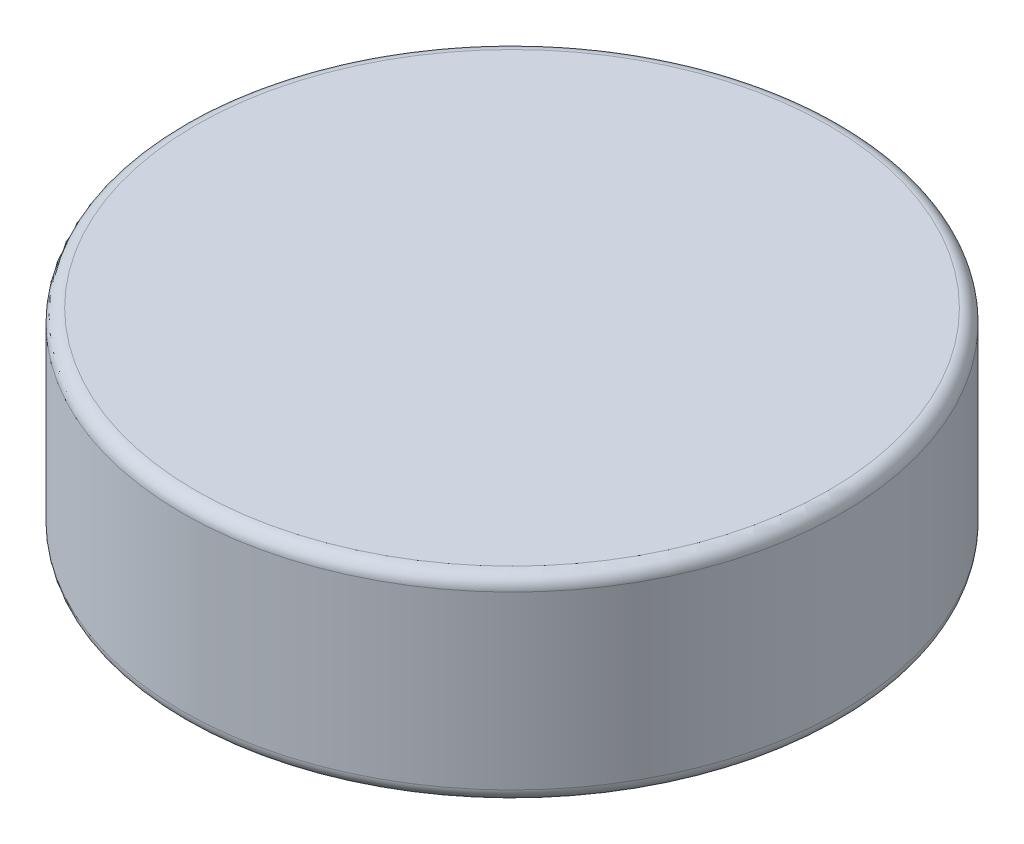
ISO-10303-21;
HEADER;
FILE_DESCRIPTION(('STEP AP214'),'2;1');
FILE_NAME('part.step','',(''),(''),'','','');
FILE_SCHEMA(('AUTOMOTIVE_DESIGN { 1 0 10303 214 1 1 1 1 }'));
ENDSEC;
DATA;
#1=APPLICATION_CONTEXT('core data for automotive mechanical design processes');
#2=APPLICATION_PROTOCOL_DEFINITION('international standard','automotive_design',2000,#1);
#3=PRODUCT_CONTEXT('',#1,'mechanical');
#4=PRODUCT('Part','Part','',(#3));
#5=PRODUCT_RELATED_PRODUCT_CATEGORY('part','',(#4));
#6=PRODUCT_DEFINITION_FORMATION('','',#4);
#7=PRODUCT_DEFINITION_CONTEXT('part definition',#1,'design');
#8=PRODUCT_DEFINITION('design','',#6,#7);
#9=PRODUCT_DEFINITION_SHAPE('','',#8);
#10=(LENGTH_UNIT() NAMED_UNIT(*) SI_UNIT(.MILLI.,.METRE.));
#11=(NAMED_UNIT(*) PLANE_ANGLE_UNIT() SI_UNIT($,.RADIAN.));
#12=(NAMED_UNIT(*) SI_UNIT($,.STERADIAN.) SOLID_ANGLE_UNIT());
#13=UNCERTAINTY_MEASURE_WITH_UNIT(LENGTH_MEASURE(1.E-05),#10,'distance_accuracy_value','');
#14=(GEOMETRIC_REPRESENTATION_CONTEXT(3) GLOBAL_UNCERTAINTY_ASSIGNED_CONTEXT((#13)) GLOBAL_UNIT_ASSIGNED_CONTEXT((#10,
#11,#12)) REPRESENTATION_CONTEXT('',''));
#15=CARTESIAN_POINT('',(0.,0.,0.));
#16=DIRECTION('',(0.,0.,1.));
#17=DIRECTION('',(1.,0.,0.));
#18=AXIS2_PLACEMENT_3D('',#15,#16,#17);
#19=CARTESIAN_POINT('',(0.,3.,0.));
#20=DIRECTION('',(0.,-1.,0.));
#21=DIRECTION('',(0.,0.,-1.));
#22=AXIS2_PLACEMENT_3D('',#19,#20,#21);
#23=CYLINDRICAL_SURFACE('',#22,5.);
#24=CARTESIAN_POINT('',(0.,0.2,0.));
#25=DIRECTION('',(0.,1.,0.));
#26=DIRECTION('',(0.,0.,1.));
#27=AXIS2_PLACEMENT_3D('',#24,#25,#26);
#28=CIRCLE('',#27,5.);
#29=CARTESIAN_POINT('',(0.,0.2,5.));
#30=VERTEX_POINT('',#29);
#31=EDGE_CURVE('E44',#30,#30,#28,.T.);
#32=ORIENTED_EDGE('',*,*,#31,.T.);
#33=EDGE_LOOP('',(#32));
#34=FACE_BOUND('',#33,.T.);
#35=CARTESIAN_POINT('',(0.,2.8,0.));
#36=DIRECTION('',(0.,1.,0.));
#37=DIRECTION('',(0.,0.,1.));
#38=AXIS2_PLACEMENT_3D('',#35,#36,#37);
#39=CIRCLE('',#38,5.);
#40=CARTESIAN_POINT('',(0.,2.8,5.));
#41=VERTEX_POINT('',#40);
#42=EDGE_CURVE('E48',#41,#41,#39,.F.);
#43=ORIENTED_EDGE('',*,*,#42,.T.);
#44=EDGE_LOOP('',(#43));
#45=FACE_BOUND('',#44,.T.);
#46=ADVANCED_FACE('F33',(#34,#45),#23,.T.);
#47=CARTESIAN_POINT('',(0.,3.,0.));
#48=DIRECTION('',(0.,1.,0.));
#49=DIRECTION('',(0.,0.,1.));
#50=AXIS2_PLACEMENT_3D('',#47,#48,#49);
#51=PLANE('',#50);
#52=CARTESIAN_POINT('',(0.,3.,0.));
#53=DIRECTION('',(0.,1.,0.));
#54=DIRECTION('',(0.,0.,1.));
#55=AXIS2_PLACEMENT_3D('',#52,#53,#54);
#56=CIRCLE('',#55,4.8);
#57=CARTESIAN_POINT('',(0.,3.,4.8));
#58=VERTEX_POINT('',#57);
#59=EDGE_CURVE('E10',#58,#58,#56,.T.);
#60=ORIENTED_EDGE('',*,*,#59,.T.);
#61=EDGE_LOOP('',(#60));
#62=FACE_BOUND('',#61,.T.);
#63=ADVANCED_FACE('F64',(#62),#51,.T.);
#64=CARTESIAN_POINT('',(0.,0.,0.));
#65=DIRECTION('',(0.,1.,0.));
#66=DIRECTION('',(0.,0.,1.));
#67=AXIS2_PLACEMENT_3D('',#64,#65,#66);
#68=PLANE('',#67);
#69=CARTESIAN_POINT('',(0.,0.,0.));
#70=DIRECTION('',(0.,1.,0.));
#71=DIRECTION('',(0.,0.,1.));
#72=AXIS2_PLACEMENT_3D('',#69,#70,#71);
#73=CIRCLE('',#72,4.8);
#74=CARTESIAN_POINT('',(0.,0.,4.8));
#75=VERTEX_POINT('',#74);
#76=EDGE_CURVE('E40',#75,#75,#73,.F.);
#77=ORIENTED_EDGE('',*,*,#76,.T.);
#78=EDGE_LOOP('',(#77));
#79=FACE_BOUND('',#78,.T.);
#80=ADVANCED_FACE('F61',(#79),#68,.F.);
#81=CARTESIAN_POINT('',(0.,0.2,0.));
#82=DIRECTION('',(0.,1.,0.));
#83=DIRECTION('',(0.,0.,1.));
#84=AXIS2_PLACEMENT_3D('',#81,#82,#83);
#85=TOROIDAL_SURFACE('',#84,4.8,0.2);
#86=ORIENTED_EDGE('',*,*,#76,.F.);
#87=EDGE_LOOP('',(#86));
#88=FACE_BOUND('',#87,.T.);
#89=ORIENTED_EDGE('',*,*,#31,.F.);
#90=EDGE_LOOP('',(#89));
#91=FACE_BOUND('',#90,.T.);
#92=ADVANCED_FACE('F57',(#88,#91),#85,.T.);
#93=CARTESIAN_POINT('',(0.,2.8,0.));
#94=DIRECTION('',(0.,1.,0.));
#95=DIRECTION('',(0.,0.,1.));
#96=AXIS2_PLACEMENT_3D('',#93,#94,#95);
#97=TOROIDAL_SURFACE('',#96,4.8,0.2);
#98=ORIENTED_EDGE('',*,*,#42,.F.);
#99=EDGE_LOOP('',(#98));
#100=FACE_BOUND('',#99,.T.);
#101=ORIENTED_EDGE('',*,*,#59,.F.);
#102=EDGE_LOOP('',(#101));
#103=FACE_BOUND('',#102,.T.);
#104=ADVANCED_FACE('F35',(#100,#103),#97,.T.);
#105=CLOSED_SHELL('',(#46,#63,#80,#92,#104));
#106=MANIFOLD_SOLID_BREP('B2',#105);
#107=ADVANCED_BREP_SHAPE_REPRESENTATION('',(#18,#106),#14);
#108=SHAPE_DEFINITION_REPRESENTATION(#9,#107);
ENDSEC;
END-ISO-10303-21;
